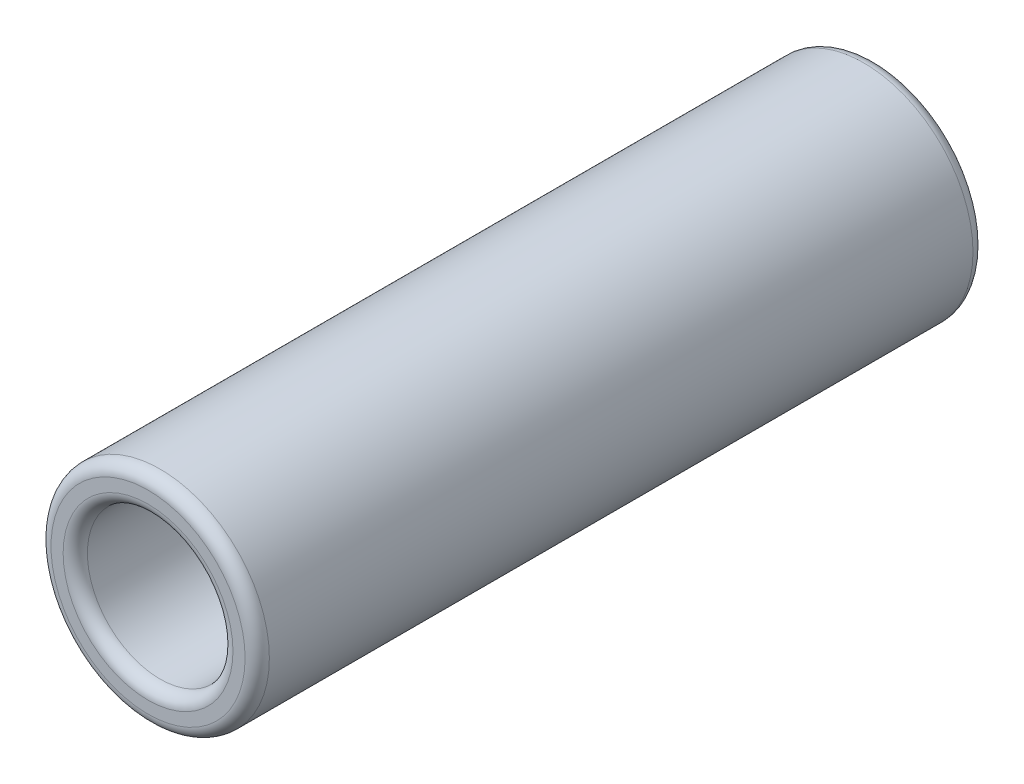
ISO-10303-21;
HEADER;
FILE_DESCRIPTION(('STEP AP214'),'2;1');
FILE_NAME('part.step','',(''),(''),'','','');
FILE_SCHEMA(('AUTOMOTIVE_DESIGN { 1 0 10303 214 1 1 1 1 }'));
ENDSEC;
DATA;
#1=APPLICATION_CONTEXT('core data for automotive mechanical design processes');
#2=APPLICATION_PROTOCOL_DEFINITION('international standard','automotive_design',2000,#1);
#3=PRODUCT_CONTEXT('',#1,'mechanical');
#4=PRODUCT('Part','Part','',(#3));
#5=PRODUCT_RELATED_PRODUCT_CATEGORY('part','',(#4));
#6=PRODUCT_DEFINITION_FORMATION('','',#4);
#7=PRODUCT_DEFINITION_CONTEXT('part definition',#1,'design');
#8=PRODUCT_DEFINITION('design','',#6,#7);
#9=PRODUCT_DEFINITION_SHAPE('','',#8);
#10=(LENGTH_UNIT() NAMED_UNIT(*) SI_UNIT(.MILLI.,.METRE.));
#11=(NAMED_UNIT(*) PLANE_ANGLE_UNIT() SI_UNIT($,.RADIAN.));
#12=(NAMED_UNIT(*) SI_UNIT($,.STERADIAN.) SOLID_ANGLE_UNIT());
#13=UNCERTAINTY_MEASURE_WITH_UNIT(LENGTH_MEASURE(1.E-05),#10,'distance_accuracy_value','');
#14=(GEOMETRIC_REPRESENTATION_CONTEXT(3) GLOBAL_UNCERTAINTY_ASSIGNED_CONTEXT((#13)) GLOBAL_UNIT_ASSIGNED_CONTEXT((#10,
#11,#12)) REPRESENTATION_CONTEXT('',''));
#15=CARTESIAN_POINT('',(0.,0.,0.));
#16=DIRECTION('',(0.,0.,1.));
#17=DIRECTION('',(1.,0.,0.));
#18=AXIS2_PLACEMENT_3D('',#15,#16,#17);
#19=CARTESIAN_POINT('',(0.,0.,15.));
#20=DIRECTION('',(0.,0.,1.));
#21=DIRECTION('',(1.,0.,0.));
#22=AXIS2_PLACEMENT_3D('',#19,#20,#21);
#23=PLANE('',#22);
#24=CARTESIAN_POINT('',(0.,0.,15.));
#25=DIRECTION('',(0.,0.,1.));
#26=DIRECTION('',(1.,0.,0.));
#27=AXIS2_PLACEMENT_3D('',#24,#25,#26);
#28=CIRCLE('',#27,3.5);
#29=CARTESIAN_POINT('',(3.5,0.,15.));
#30=VERTEX_POINT('',#29);
#31=EDGE_CURVE('E10',#30,#30,#28,.F.);
#32=ORIENTED_EDGE('',*,*,#31,.T.);
#33=EDGE_LOOP('',(#32));
#34=FACE_BOUND('',#33,.T.);
#35=CARTESIAN_POINT('',(0.,0.,15.));
#36=DIRECTION('',(0.,0.,1.));
#37=DIRECTION('',(1.,0.,0.));
#38=AXIS2_PLACEMENT_3D('',#35,#36,#37);
#39=CIRCLE('',#38,4.);
#40=CARTESIAN_POINT('',(4.,0.,15.));
#41=VERTEX_POINT('',#40);
#42=EDGE_CURVE('E45',#41,#41,#39,.T.);
#43=ORIENTED_EDGE('',*,*,#42,.T.);
#44=EDGE_LOOP('',(#43));
#45=FACE_BOUND('',#44,.T.);
#46=ADVANCED_FACE('F37',(#34,#45),#23,.T.);
#47=CARTESIAN_POINT('',(0.,0.,-15.));
#48=DIRECTION('',(0.,0.,1.));
#49=DIRECTION('',(1.,0.,0.));
#50=AXIS2_PLACEMENT_3D('',#47,#48,#49);
#51=PLANE('',#50);
#52=CARTESIAN_POINT('',(0.,0.,-15.));
#53=DIRECTION('',(0.,0.,1.));
#54=DIRECTION('',(1.,0.,0.));
#55=AXIS2_PLACEMENT_3D('',#52,#53,#54);
#56=CIRCLE('',#55,4.);
#57=CARTESIAN_POINT('',(4.,0.,-15.));
#58=VERTEX_POINT('',#57);
#59=EDGE_CURVE('E61',#58,#58,#56,.F.);
#60=ORIENTED_EDGE('',*,*,#59,.T.);
#61=EDGE_LOOP('',(#60));
#62=FACE_BOUND('',#61,.T.);
#63=CARTESIAN_POINT('',(0.,0.,-15.));
#64=DIRECTION('',(0.,0.,1.));
#65=DIRECTION('',(1.,0.,0.));
#66=AXIS2_PLACEMENT_3D('',#63,#64,#65);
#67=CIRCLE('',#66,3.5);
#68=CARTESIAN_POINT('',(3.5,0.,-15.));
#69=VERTEX_POINT('',#68);
#70=EDGE_CURVE('E65',#69,#69,#67,.T.);
#71=ORIENTED_EDGE('',*,*,#70,.T.);
#72=EDGE_LOOP('',(#71));
#73=FACE_BOUND('',#72,.T.);
#74=ADVANCED_FACE('F89',(#62,#73),#51,.F.);
#75=CARTESIAN_POINT('',(0.,0.,15.));
#76=DIRECTION('',(0.,0.,-1.));
#77=DIRECTION('',(-1.,0.,0.));
#78=AXIS2_PLACEMENT_3D('',#75,#76,#77);
#79=CYLINDRICAL_SURFACE('',#78,4.5);
#80=CARTESIAN_POINT('',(0.,0.,-14.5));
#81=DIRECTION('',(0.,0.,1.));
#82=DIRECTION('',(1.,0.,0.));
#83=AXIS2_PLACEMENT_3D('',#80,#81,#82);
#84=CIRCLE('',#83,4.5);
#85=CARTESIAN_POINT('',(4.5,0.,-14.5));
#86=VERTEX_POINT('',#85);
#87=EDGE_CURVE('E69',#86,#86,#84,.T.);
#88=ORIENTED_EDGE('',*,*,#87,.T.);
#89=EDGE_LOOP('',(#88));
#90=FACE_BOUND('',#89,.T.);
#91=CARTESIAN_POINT('',(0.,0.,14.5));
#92=DIRECTION('',(0.,0.,1.));
#93=DIRECTION('',(1.,0.,0.));
#94=AXIS2_PLACEMENT_3D('',#91,#92,#93);
#95=CIRCLE('',#94,4.5);
#96=CARTESIAN_POINT('',(4.5,0.,14.5));
#97=VERTEX_POINT('',#96);
#98=EDGE_CURVE('E73',#97,#97,#95,.F.);
#99=ORIENTED_EDGE('',*,*,#98,.T.);
#100=EDGE_LOOP('',(#99));
#101=FACE_BOUND('',#100,.T.);
#102=ADVANCED_FACE('F78',(#90,#101),#79,.T.);
#103=CARTESIAN_POINT('',(0.,0.,15.));
#104=DIRECTION('',(0.,0.,-1.));
#105=DIRECTION('',(-1.,0.,0.));
#106=AXIS2_PLACEMENT_3D('',#103,#104,#105);
#107=CYLINDRICAL_SURFACE('',#106,3.);
#108=CARTESIAN_POINT('',(0.,0.,-14.5));
#109=DIRECTION('',(0.,0.,1.));
#110=DIRECTION('',(1.,0.,0.));
#111=AXIS2_PLACEMENT_3D('',#108,#109,#110);
#112=CIRCLE('',#111,3.);
#113=CARTESIAN_POINT('',(3.,0.,-14.5));
#114=VERTEX_POINT('',#113);
#115=EDGE_CURVE('E50',#114,#114,#112,.F.);
#116=ORIENTED_EDGE('',*,*,#115,.T.);
#117=EDGE_LOOP('',(#116));
#118=FACE_BOUND('',#117,.T.);
#119=CARTESIAN_POINT('',(0.,0.,14.5));
#120=DIRECTION('',(0.,0.,1.));
#121=DIRECTION('',(1.,0.,0.));
#122=AXIS2_PLACEMENT_3D('',#119,#120,#121);
#123=CIRCLE('',#122,3.);
#124=CARTESIAN_POINT('',(3.,0.,14.5));
#125=VERTEX_POINT('',#124);
#126=EDGE_CURVE('E55',#125,#125,#123,.T.);
#127=ORIENTED_EDGE('',*,*,#126,.T.);
#128=EDGE_LOOP('',(#127));
#129=FACE_BOUND('',#128,.T.);
#130=ADVANCED_FACE('F97',(#118,#129),#107,.F.);
#131=CARTESIAN_POINT('',(0.,0.,-14.5));
#132=DIRECTION('',(0.,0.,1.));
#133=DIRECTION('',(1.,0.,0.));
#134=AXIS2_PLACEMENT_3D('',#131,#132,#133);
#135=TOROIDAL_SURFACE('',#134,4.,0.5);
#136=ORIENTED_EDGE('',*,*,#59,.F.);
#137=EDGE_LOOP('',(#136));
#138=FACE_BOUND('',#137,.T.);
#139=ORIENTED_EDGE('',*,*,#87,.F.);
#140=EDGE_LOOP('',(#139));
#141=FACE_BOUND('',#140,.T.);
#142=ADVANCED_FACE('F102',(#138,#141),#135,.T.);
#143=CARTESIAN_POINT('',(0.,0.,-14.5));
#144=DIRECTION('',(0.,0.,1.));
#145=DIRECTION('',(1.,0.,0.));
#146=AXIS2_PLACEMENT_3D('',#143,#144,#145);
#147=TOROIDAL_SURFACE('',#146,3.5,0.5);
#148=ORIENTED_EDGE('',*,*,#115,.F.);
#149=EDGE_LOOP('',(#148));
#150=FACE_BOUND('',#149,.T.);
#151=ORIENTED_EDGE('',*,*,#70,.F.);
#152=EDGE_LOOP('',(#151));
#153=FACE_BOUND('',#152,.T.);
#154=ADVANCED_FACE('F86',(#150,#153),#147,.T.);
#155=CARTESIAN_POINT('',(0.,0.,14.5));
#156=DIRECTION('',(0.,0.,1.));
#157=DIRECTION('',(1.,0.,0.));
#158=AXIS2_PLACEMENT_3D('',#155,#156,#157);
#159=TOROIDAL_SURFACE('',#158,3.5,0.5);
#160=ORIENTED_EDGE('',*,*,#31,.F.);
#161=EDGE_LOOP('',(#160));
#162=FACE_BOUND('',#161,.T.);
#163=ORIENTED_EDGE('',*,*,#126,.F.);
#164=EDGE_LOOP('',(#163));
#165=FACE_BOUND('',#164,.T.);
#166=ADVANCED_FACE('F82',(#162,#165),#159,.T.);
#167=CARTESIAN_POINT('',(0.,0.,14.5));
#168=DIRECTION('',(0.,0.,1.));
#169=DIRECTION('',(1.,0.,0.));
#170=AXIS2_PLACEMENT_3D('',#167,#168,#169);
#171=TOROIDAL_SURFACE('',#170,4.,0.5);
#172=ORIENTED_EDGE('',*,*,#98,.F.);
#173=EDGE_LOOP('',(#172));
#174=FACE_BOUND('',#173,.T.);
#175=ORIENTED_EDGE('',*,*,#42,.F.);
#176=EDGE_LOOP('',(#175));
#177=FACE_BOUND('',#176,.T.);
#178=ADVANCED_FACE('F39',(#174,#177),#171,.T.);
#179=CLOSED_SHELL('',(#46,#74,#102,#130,#142,#154,#166,#178));
#180=MANIFOLD_SOLID_BREP('B2',#179);
#181=ADVANCED_BREP_SHAPE_REPRESENTATION('',(#18,#180),#14);
#182=SHAPE_DEFINITION_REPRESENTATION(#9,#181);
ENDSEC;
END-ISO-10303-21;
